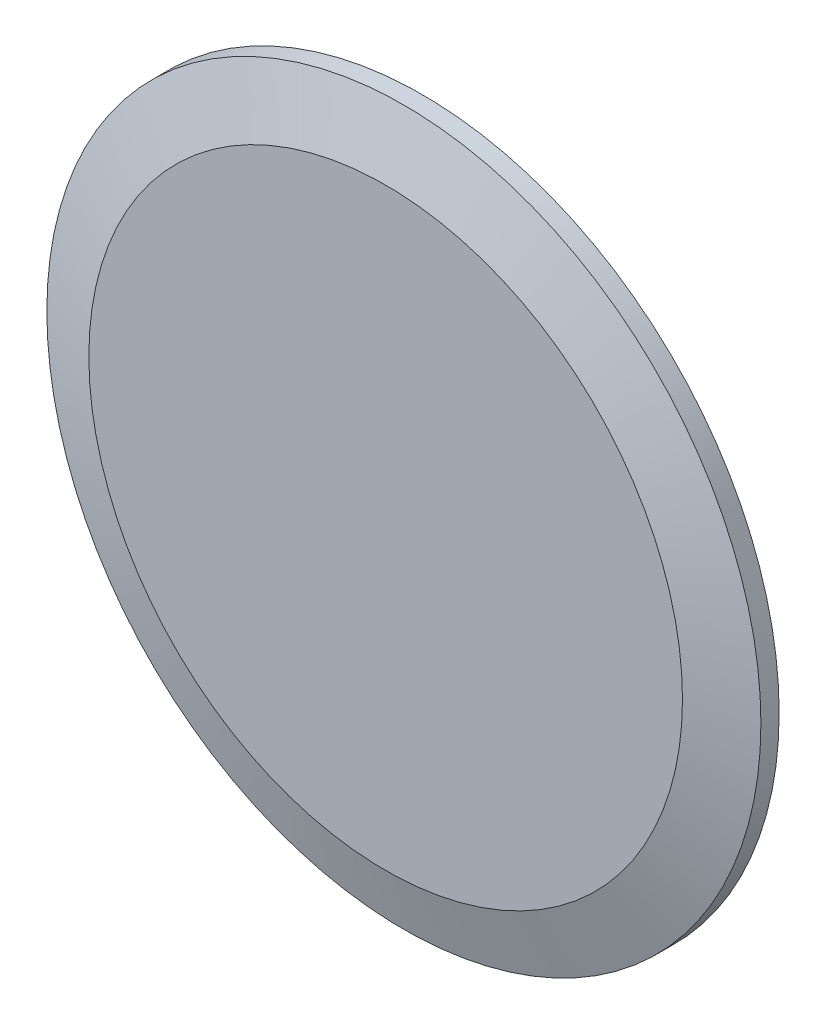
ISO-10303-21;
HEADER;
FILE_DESCRIPTION(('STEP AP214'),'2;1');
FILE_NAME('part.step','',(''),(''),'','','');
FILE_SCHEMA(('AUTOMOTIVE_DESIGN { 1 0 10303 214 1 1 1 1 }'));
ENDSEC;
DATA;
#1=APPLICATION_CONTEXT('core data for automotive mechanical design processes');
#2=APPLICATION_PROTOCOL_DEFINITION('international standard','automotive_design',2000,#1);
#3=PRODUCT_CONTEXT('',#1,'mechanical');
#4=PRODUCT('Part','Part','',(#3));
#5=PRODUCT_RELATED_PRODUCT_CATEGORY('part','',(#4));
#6=PRODUCT_DEFINITION_FORMATION('','',#4);
#7=PRODUCT_DEFINITION_CONTEXT('part definition',#1,'design');
#8=PRODUCT_DEFINITION('design','',#6,#7);
#9=PRODUCT_DEFINITION_SHAPE('','',#8);
#10=(LENGTH_UNIT() NAMED_UNIT(*) SI_UNIT(.MILLI.,.METRE.));
#11=(NAMED_UNIT(*) PLANE_ANGLE_UNIT() SI_UNIT($,.RADIAN.));
#12=(NAMED_UNIT(*) SI_UNIT($,.STERADIAN.) SOLID_ANGLE_UNIT());
#13=UNCERTAINTY_MEASURE_WITH_UNIT(LENGTH_MEASURE(1.E-05),#10,'distance_accuracy_value','');
#14=(GEOMETRIC_REPRESENTATION_CONTEXT(3) GLOBAL_UNCERTAINTY_ASSIGNED_CONTEXT((#13)) GLOBAL_UNIT_ASSIGNED_CONTEXT((#10,
#11,#12)) REPRESENTATION_CONTEXT('',''));
#15=CARTESIAN_POINT('',(0.,0.,0.));
#16=DIRECTION('',(0.,0.,1.));
#17=DIRECTION('',(1.,0.,0.));
#18=AXIS2_PLACEMENT_3D('',#15,#16,#17);
#19=CARTESIAN_POINT('',(0.,0.,2.15));
#20=DIRECTION('',(0.,0.,-1.));
#21=DIRECTION('',(-1.,0.,0.));
#22=AXIS2_PLACEMENT_3D('',#19,#20,#21);
#23=CYLINDRICAL_SURFACE('',#22,21.05);
#24=CARTESIAN_POINT('',(0.,0.,0.));
#25=DIRECTION('',(0.,0.,1.));
#26=DIRECTION('',(1.,0.,0.));
#27=AXIS2_PLACEMENT_3D('',#24,#25,#26);
#28=CIRCLE('',#27,21.05);
#29=CARTESIAN_POINT('',(-21.05,0.,0.));
#30=VERTEX_POINT('',#29);
#31=EDGE_CURVE('E10',#30,#30,#28,.T.);
#32=CARTESIAN_POINT('',(0.,0.,1.075));
#33=DIRECTION('',(0.,0.,-1.));
#34=DIRECTION('',(-1.,0.,0.));
#35=AXIS2_PLACEMENT_3D('',#32,#33,#34);
#36=CIRCLE('',#35,21.05);
#37=CARTESIAN_POINT('',(-21.05,0.,1.075));
#38=VERTEX_POINT('',#37);
#39=EDGE_CURVE('E54',#38,#38,#36,.T.);
#40=CARTESIAN_POINT('',(-21.05,0.,0.));
#41=CARTESIAN_POINT('',(-21.05,0.,0.0111979166666663));
#42=CARTESIAN_POINT('',(-21.05,0.,0.022395833333333));
#43=CARTESIAN_POINT('',(-21.05,0.,0.0447916666666664));
#44=CARTESIAN_POINT('',(-21.05,0.,0.0559895833333329));
#45=CARTESIAN_POINT('',(-21.05,0.,0.0783854166666663));
#46=CARTESIAN_POINT('',(-21.05,0.,0.089583333333333));
#47=CARTESIAN_POINT('',(-21.05,0.,0.111979166666666));
#48=CARTESIAN_POINT('',(-21.05,0.,0.123177083333333));
#49=CARTESIAN_POINT('',(-21.05,0.,0.145572916666666));
#50=CARTESIAN_POINT('',(-21.05,0.,0.156770833333333));
#51=CARTESIAN_POINT('',(-21.05,0.,0.179166666666666));
#52=CARTESIAN_POINT('',(-21.05,0.,0.190364583333333));
#53=CARTESIAN_POINT('',(-21.05,0.,0.212760416666666));
#54=CARTESIAN_POINT('',(-21.05,0.,0.223958333333333));
#55=CARTESIAN_POINT('',(-21.05,0.,0.246354166666666));
#56=CARTESIAN_POINT('',(-21.05,0.,0.257552083333333));
#57=CARTESIAN_POINT('',(-21.05,0.,0.279947916666666));
#58=CARTESIAN_POINT('',(-21.05,0.,0.291145833333333));
#59=CARTESIAN_POINT('',(-21.05,0.,0.313541666666666));
#60=CARTESIAN_POINT('',(-21.05,0.,0.324739583333333));
#61=CARTESIAN_POINT('',(-21.05,0.,0.347135416666666));
#62=CARTESIAN_POINT('',(-21.05,0.,0.358333333333333));
#63=CARTESIAN_POINT('',(-21.05,0.,0.380729166666666));
#64=CARTESIAN_POINT('',(-21.05,0.,0.391927083333333));
#65=CARTESIAN_POINT('',(-21.05,0.,0.414322916666666));
#66=CARTESIAN_POINT('',(-21.05,0.,0.425520833333333));
#67=CARTESIAN_POINT('',(-21.05,0.,0.447916666666666));
#68=CARTESIAN_POINT('',(-21.05,0.,0.459114583333333));
#69=CARTESIAN_POINT('',(-21.05,0.,0.481510416666666));
#70=CARTESIAN_POINT('',(-21.05,0.,0.492708333333333));
#71=CARTESIAN_POINT('',(-21.05,0.,0.515104166666666));
#72=CARTESIAN_POINT('',(-21.05,0.,0.526302083333333));
#73=CARTESIAN_POINT('',(-21.05,0.,0.548697916666666));
#74=CARTESIAN_POINT('',(-21.05,0.,0.559895833333333));
#75=CARTESIAN_POINT('',(-21.05,0.,0.582291666666667));
#76=CARTESIAN_POINT('',(-21.05,0.,0.593489583333333));
#77=CARTESIAN_POINT('',(-21.05,0.,0.615885416666667));
#78=CARTESIAN_POINT('',(-21.05,0.,0.627083333333333));
#79=CARTESIAN_POINT('',(-21.05,0.,0.649479166666666));
#80=CARTESIAN_POINT('',(-21.05,0.,0.660677083333333));
#81=CARTESIAN_POINT('',(-21.05,0.,0.683072916666667));
#82=CARTESIAN_POINT('',(-21.05,0.,0.694270833333333));
#83=CARTESIAN_POINT('',(-21.05,0.,0.716666666666667));
#84=CARTESIAN_POINT('',(-21.05,0.,0.727864583333333));
#85=CARTESIAN_POINT('',(-21.05,0.,0.750260416666667));
#86=CARTESIAN_POINT('',(-21.05,0.,0.761458333333333));
#87=CARTESIAN_POINT('',(-21.05,0.,0.783854166666667));
#88=CARTESIAN_POINT('',(-21.05,0.,0.795052083333333));
#89=CARTESIAN_POINT('',(-21.05,0.,0.817447916666667));
#90=CARTESIAN_POINT('',(-21.05,0.,0.828645833333333));
#91=CARTESIAN_POINT('',(-21.05,0.,0.851041666666667));
#92=CARTESIAN_POINT('',(-21.05,0.,0.862239583333334));
#93=CARTESIAN_POINT('',(-21.05,0.,0.884635416666667));
#94=CARTESIAN_POINT('',(-21.05,0.,0.895833333333333));
#95=CARTESIAN_POINT('',(-21.05,0.,0.918229166666667));
#96=CARTESIAN_POINT('',(-21.05,0.,0.929427083333333));
#97=CARTESIAN_POINT('',(-21.05,0.,0.951822916666667));
#98=CARTESIAN_POINT('',(-21.05,0.,0.963020833333333));
#99=CARTESIAN_POINT('',(-21.05,0.,0.985416666666667));
#100=CARTESIAN_POINT('',(-21.05,0.,0.996614583333334));
#101=CARTESIAN_POINT('',(-21.05,0.,1.01901041666667));
#102=CARTESIAN_POINT('',(-21.05,0.,1.03020833333333));
#103=CARTESIAN_POINT('',(-21.05,0.,1.05260416666667));
#104=CARTESIAN_POINT('',(-21.05,0.,1.06380208333333));
#105=CARTESIAN_POINT('',(-21.05,0.,1.075));
#106=B_SPLINE_CURVE_WITH_KNOTS('',3,(#40,#41,#42,#43,#44,#45,#46,#47,#48,#49,#50,#51,#52,#53,
#54,#55,#56,#57,#58,#59,#60,#61,#62,#63,#64,#65,#66,#67,#68,#69,#70,#71,#72,#73,#74,#75,#76,#77,
#78,#79,#80,#81,#82,#83,#84,#85,#86,#87,#88,#89,#90,#91,#92,#93,#94,#95,#96,#97,#98,#99,#100,
#101,#102,#103,#104,#105),.UNSPECIFIED.,.F.,.F.,(4,2,2,2,2,2,2,2,2,2,2,2,2,2,2,2,2,2,2,2,2,2,2,
2,2,2,2,2,2,2,2,2,4),(0.,0.0335937500000002,0.0671875,0.10078125,0.134375,0.16796875,0.2015625,
0.23515625,0.26875,0.30234375,0.3359375,0.36953125,0.403125,0.43671875,0.4703125,0.50390625,
0.5375,0.57109375,0.6046875,0.63828125,0.671875,0.70546875,0.7390625,0.772656250000001,0.80625,
0.839843750000001,0.873437500000001,0.907031250000001,0.940625,0.97421875,1.0078125,1.04140625,
1.075),.UNSPECIFIED.);
#107=EDGE_CURVE('BSEAM47',#30,#38,#106,.T.);
#108=ORIENTED_EDGE('',*,*,#31,.T.);
#109=ORIENTED_EDGE('',*,*,#39,.T.);
#110=ORIENTED_EDGE('',*,*,#107,.T.);
#111=ORIENTED_EDGE('',*,*,#107,.F.);
#112=EDGE_LOOP('',(#108,#110,#109,#111));
#113=FACE_BOUND('',#112,.T.);
#114=ADVANCED_FACE('F47',(#113),#23,.T.);
#115=CARTESIAN_POINT('',(0.,0.,0.));
#116=DIRECTION('',(0.,0.,1.));
#117=DIRECTION('',(1.,0.,0.));
#118=AXIS2_PLACEMENT_3D('',#115,#116,#117);
#119=PLANE('',#118);
#120=ORIENTED_EDGE('',*,*,#31,.F.);
#121=EDGE_LOOP('',(#120));
#122=FACE_BOUND('',#121,.T.);
#123=ADVANCED_FACE('F77',(#122),#119,.F.);
#124=CARTESIAN_POINT('',(0.,0.,1.075));
#125=DIRECTION('',(0.,0.,-1.));
#126=DIRECTION('',(-1.,0.,0.));
#127=AXIS2_PLACEMENT_3D('',#124,#125,#126);
#128=CONICAL_SURFACE('',#127,21.05,1.27675722688841);
#129=CARTESIAN_POINT('',(0.,0.,2.15));
#130=DIRECTION('',(0.,0.,-1.));
#131=DIRECTION('',(-1.,0.,0.));
#132=AXIS2_PLACEMENT_3D('',#129,#130,#131);
#133=CIRCLE('',#132,17.5);
#134=CARTESIAN_POINT('',(-17.5,0.,2.15));
#135=VERTEX_POINT('',#134);
#136=EDGE_CURVE('E59',#135,#135,#133,.T.);
#137=ORIENTED_EDGE('',*,*,#136,.T.);
#138=EDGE_LOOP('',(#137));
#139=FACE_BOUND('',#138,.T.);
#140=ORIENTED_EDGE('',*,*,#39,.F.);
#141=EDGE_LOOP('',(#140));
#142=FACE_BOUND('',#141,.T.);
#143=ADVANCED_FACE('F67',(#139,#142),#128,.T.);
#144=CARTESIAN_POINT('',(0.,0.,2.15));
#145=DIRECTION('',(0.,0.,1.));
#146=DIRECTION('',(1.,0.,0.));
#147=AXIS2_PLACEMENT_3D('',#144,#145,#146);
#148=PLANE('',#147);
#149=ORIENTED_EDGE('',*,*,#136,.F.);
#150=EDGE_LOOP('',(#149));
#151=FACE_BOUND('',#150,.T.);
#152=ADVANCED_FACE('F70',(#151),#148,.T.);
#153=CLOSED_SHELL('',(#114,#123,#143,#152));
#154=MANIFOLD_SOLID_BREP('B2',#153);
#155=ADVANCED_BREP_SHAPE_REPRESENTATION('',(#18,#154),#14);
#156=SHAPE_DEFINITION_REPRESENTATION(#9,#155);
ENDSEC;
END-ISO-10303-21;
